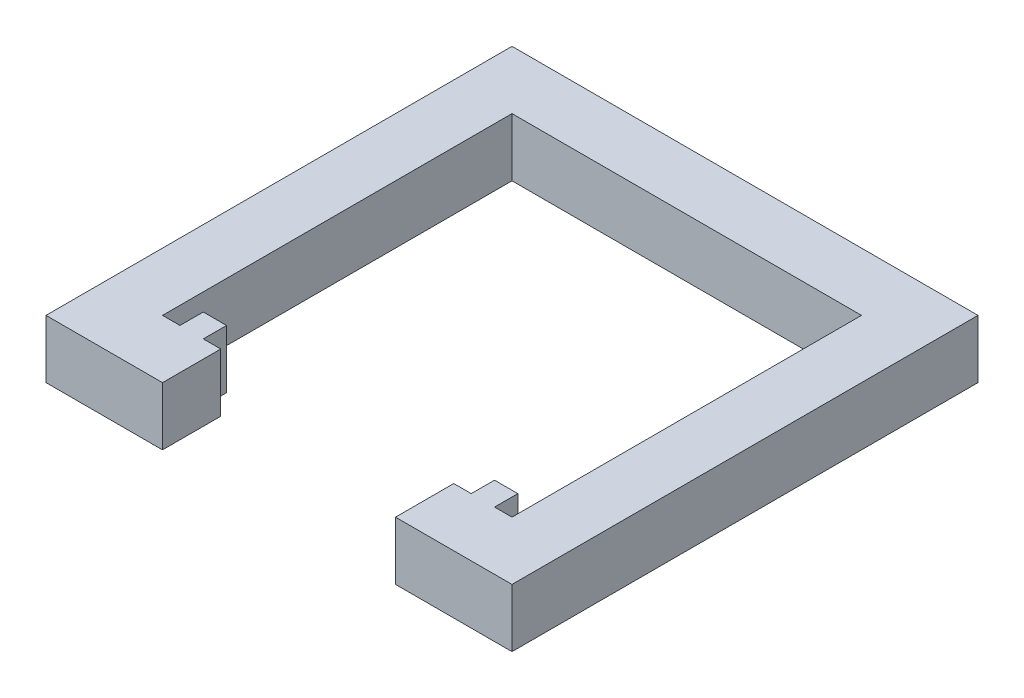
ISO-10303-21;
HEADER;
FILE_DESCRIPTION(('STEP AP214'),'2;1');
FILE_NAME('part.step','',(''),(''),'','','');
FILE_SCHEMA(('AUTOMOTIVE_DESIGN { 1 0 10303 214 1 1 1 1 }'));
ENDSEC;
DATA;
#1=APPLICATION_CONTEXT('core data for automotive mechanical design processes');
#2=APPLICATION_PROTOCOL_DEFINITION('international standard','automotive_design',2000,#1);
#3=PRODUCT_CONTEXT('',#1,'mechanical');
#4=PRODUCT('Part','Part','',(#3));
#5=PRODUCT_RELATED_PRODUCT_CATEGORY('part','',(#4));
#6=PRODUCT_DEFINITION_FORMATION('','',#4);
#7=PRODUCT_DEFINITION_CONTEXT('part definition',#1,'design');
#8=PRODUCT_DEFINITION('design','',#6,#7);
#9=PRODUCT_DEFINITION_SHAPE('','',#8);
#10=(LENGTH_UNIT() NAMED_UNIT(*) SI_UNIT(.MILLI.,.METRE.));
#11=(NAMED_UNIT(*) PLANE_ANGLE_UNIT() SI_UNIT($,.RADIAN.));
#12=(NAMED_UNIT(*) SI_UNIT($,.STERADIAN.) SOLID_ANGLE_UNIT());
#13=UNCERTAINTY_MEASURE_WITH_UNIT(LENGTH_MEASURE(1.E-05),#10,'distance_accuracy_value','');
#14=(GEOMETRIC_REPRESENTATION_CONTEXT(3) GLOBAL_UNCERTAINTY_ASSIGNED_CONTEXT((#13)) GLOBAL_UNIT_ASSIGNED_CONTEXT((#10,
#11,#12)) REPRESENTATION_CONTEXT('',''));
#15=CARTESIAN_POINT('',(0.,0.,0.));
#16=DIRECTION('',(0.,0.,1.));
#17=DIRECTION('',(1.,0.,0.));
#18=AXIS2_PLACEMENT_3D('',#15,#16,#17);
#19=CARTESIAN_POINT('',(198.887732839115,50.,0.));
#20=DIRECTION('',(1.,0.,0.));
#21=DIRECTION('',(0.,0.,-1.));
#22=AXIS2_PLACEMENT_3D('',#19,#20,#21);
#23=PLANE('',#22);
#24=DIRECTION('',(0.,0.,1.));
#25=VECTOR('',#24,1.);
#26=CARTESIAN_POINT('',(198.887732839115,0.,0.));
#27=LINE('',#26,#25);
#28=CARTESIAN_POINT('',(198.887732839115,0.,60.9875274496841));
#29=VERTEX_POINT('',#28);
#30=CARTESIAN_POINT('',(198.887732839116,0.,360.987527449684));
#31=VERTEX_POINT('',#30);
#32=EDGE_CURVE('E204',#29,#31,#27,.T.);
#33=ORIENTED_EDGE('',*,*,#32,.T.);
#34=DIRECTION('',(0.,-1.,0.));
#35=VECTOR('',#34,1.);
#36=CARTESIAN_POINT('',(198.887732839116,50.,360.987527449684));
#37=LINE('',#36,#35);
#38=CARTESIAN_POINT('',(198.887732839116,50.,360.987527449684));
#39=VERTEX_POINT('',#38);
#40=EDGE_CURVE('E11',#39,#31,#37,.T.);
#41=ORIENTED_EDGE('',*,*,#40,.F.);
#42=DIRECTION('',(0.,0.,1.));
#43=VECTOR('',#42,1.);
#44=CARTESIAN_POINT('',(198.887732839115,50.,0.));
#45=LINE('',#44,#43);
#46=CARTESIAN_POINT('',(198.887732839115,50.,60.9875274496841));
#47=VERTEX_POINT('',#46);
#48=EDGE_CURVE('E124',#47,#39,#45,.T.);
#49=ORIENTED_EDGE('',*,*,#48,.F.);
#50=DIRECTION('',(0.,-1.,0.));
#51=VECTOR('',#50,1.);
#52=CARTESIAN_POINT('',(198.887732839115,50.,60.9875274496841));
#53=LINE('',#52,#51);
#54=EDGE_CURVE('E199',#47,#29,#53,.T.);
#55=ORIENTED_EDGE('',*,*,#54,.T.);
#56=EDGE_LOOP('',(#33,#41,#49,#55));
#57=FACE_BOUND('',#56,.T.);
#58=ADVANCED_FACE('F36',(#57),#23,.F.);
#59=CARTESIAN_POINT('',(-4.00776664577145E-13,50.,360.987527449684));
#60=DIRECTION('',(0.,0.,-1.));
#61=DIRECTION('',(-1.,0.,0.));
#62=AXIS2_PLACEMENT_3D('',#59,#60,#61);
#63=PLANE('',#62);
#64=DIRECTION('',(1.,0.,0.));
#65=VECTOR('',#64,1.);
#66=CARTESIAN_POINT('',(-4.00776664577145E-13,0.,360.987527449684));
#67=LINE('',#66,#65);
#68=CARTESIAN_POINT('',(183.887732839116,0.,360.987527449684));
#69=VERTEX_POINT('',#68);
#70=EDGE_CURVE('E207',#69,#31,#67,.T.);
#71=ORIENTED_EDGE('',*,*,#70,.F.);
#72=DIRECTION('',(0.,-1.,0.));
#73=VECTOR('',#72,1.);
#74=CARTESIAN_POINT('',(183.887732839116,50.,360.987527449684));
#75=LINE('',#74,#73);
#76=CARTESIAN_POINT('',(183.887732839116,50.,360.987527449684));
#77=VERTEX_POINT('',#76);
#78=EDGE_CURVE('E44',#77,#69,#75,.T.);
#79=ORIENTED_EDGE('',*,*,#78,.F.);
#80=DIRECTION('',(1.,0.,0.));
#81=VECTOR('',#80,1.);
#82=CARTESIAN_POINT('',(-4.00776664577145E-13,50.,360.987527449684));
#83=LINE('',#82,#81);
#84=EDGE_CURVE('E308',#77,#39,#83,.T.);
#85=ORIENTED_EDGE('',*,*,#84,.T.);
#86=ORIENTED_EDGE('',*,*,#40,.T.);
#87=EDGE_LOOP('',(#71,#79,#85,#86));
#88=FACE_BOUND('',#87,.T.);
#89=ADVANCED_FACE('F295',(#88),#63,.T.);
#90=CARTESIAN_POINT('',(183.887732839115,50.,-2.55195493680131E-13));
#91=DIRECTION('',(1.,0.,0.));
#92=DIRECTION('',(0.,0.,-1.));
#93=AXIS2_PLACEMENT_3D('',#90,#91,#92);
#94=PLANE('',#93);
#95=DIRECTION('',(0.,0.,1.));
#96=VECTOR('',#95,1.);
#97=CARTESIAN_POINT('',(183.887732839115,0.,-2.55195493680131E-13));
#98=LINE('',#97,#96);
#99=CARTESIAN_POINT('',(183.887732839115,0.,340.987527449684));
#100=VERTEX_POINT('',#99);
#101=EDGE_CURVE('E210',#100,#69,#98,.T.);
#102=ORIENTED_EDGE('',*,*,#101,.F.);
#103=DIRECTION('',(0.,-1.,0.));
#104=VECTOR('',#103,1.);
#105=CARTESIAN_POINT('',(183.887732839115,50.,340.987527449684));
#106=LINE('',#105,#104);
#107=CARTESIAN_POINT('',(183.887732839115,50.,340.987527449684));
#108=VERTEX_POINT('',#107);
#109=EDGE_CURVE('E285',#108,#100,#106,.T.);
#110=ORIENTED_EDGE('',*,*,#109,.F.);
#111=DIRECTION('',(0.,0.,1.));
#112=VECTOR('',#111,1.);
#113=CARTESIAN_POINT('',(183.887732839115,50.,-2.55195493680131E-13));
#114=LINE('',#113,#112);
#115=EDGE_CURVE('E292',#108,#77,#114,.T.);
#116=ORIENTED_EDGE('',*,*,#115,.T.);
#117=ORIENTED_EDGE('',*,*,#78,.T.);
#118=EDGE_LOOP('',(#102,#110,#116,#117));
#119=FACE_BOUND('',#118,.T.);
#120=ADVANCED_FACE('F290',(#119),#94,.T.);
#121=CARTESIAN_POINT('',(0.,50.,340.987527449684));
#122=DIRECTION('',(0.,0.,-1.));
#123=DIRECTION('',(-1.,0.,0.));
#124=AXIS2_PLACEMENT_3D('',#121,#122,#123);
#125=PLANE('',#124);
#126=DIRECTION('',(1.,0.,0.));
#127=VECTOR('',#126,1.);
#128=CARTESIAN_POINT('',(0.,0.,340.987527449684));
#129=LINE('',#128,#127);
#130=CARTESIAN_POINT('',(163.887732839115,0.,340.987527449684));
#131=VERTEX_POINT('',#130);
#132=EDGE_CURVE('E214',#131,#100,#129,.T.);
#133=ORIENTED_EDGE('',*,*,#132,.F.);
#134=DIRECTION('',(0.,-1.,0.));
#135=VECTOR('',#134,1.);
#136=CARTESIAN_POINT('',(163.887732839115,50.,340.987527449684));
#137=LINE('',#136,#135);
#138=CARTESIAN_POINT('',(163.887732839115,50.,340.987527449684));
#139=VERTEX_POINT('',#138);
#140=EDGE_CURVE('E283',#139,#131,#137,.T.);
#141=ORIENTED_EDGE('',*,*,#140,.F.);
#142=DIRECTION('',(1.,0.,0.));
#143=VECTOR('',#142,1.);
#144=CARTESIAN_POINT('',(0.,50.,340.987527449684));
#145=LINE('',#144,#143);
#146=EDGE_CURVE('E307',#139,#108,#145,.T.);
#147=ORIENTED_EDGE('',*,*,#146,.T.);
#148=ORIENTED_EDGE('',*,*,#109,.T.);
#149=EDGE_LOOP('',(#133,#141,#147,#148));
#150=FACE_BOUND('',#149,.T.);
#151=ADVANCED_FACE('F303',(#150),#125,.T.);
#152=CARTESIAN_POINT('',(163.887732839115,50.,-2.27439918064502E-13));
#153=DIRECTION('',(1.,0.,0.));
#154=DIRECTION('',(0.,0.,-1.));
#155=AXIS2_PLACEMENT_3D('',#152,#153,#154);
#156=PLANE('',#155);
#157=DIRECTION('',(0.,0.,1.));
#158=VECTOR('',#157,1.);
#159=CARTESIAN_POINT('',(163.887732839115,0.,-2.27439918064502E-13));
#160=LINE('',#159,#158);
#161=CARTESIAN_POINT('',(163.887732839116,0.,360.987527449684));
#162=VERTEX_POINT('',#161);
#163=EDGE_CURVE('E217',#131,#162,#160,.T.);
#164=ORIENTED_EDGE('',*,*,#163,.T.);
#165=DIRECTION('',(0.,-1.,0.));
#166=VECTOR('',#165,1.);
#167=CARTESIAN_POINT('',(163.887732839116,50.,360.987527449684));
#168=LINE('',#167,#166);
#169=CARTESIAN_POINT('',(163.887732839116,50.,360.987527449684));
#170=VERTEX_POINT('',#169);
#171=EDGE_CURVE('E281',#170,#162,#168,.T.);
#172=ORIENTED_EDGE('',*,*,#171,.F.);
#173=DIRECTION('',(0.,0.,1.));
#174=VECTOR('',#173,1.);
#175=CARTESIAN_POINT('',(163.887732839115,50.,-2.27439918064502E-13));
#176=LINE('',#175,#174);
#177=EDGE_CURVE('E310',#139,#170,#176,.T.);
#178=ORIENTED_EDGE('',*,*,#177,.F.);
#179=ORIENTED_EDGE('',*,*,#140,.T.);
#180=EDGE_LOOP('',(#164,#172,#178,#179));
#181=FACE_BOUND('',#180,.T.);
#182=ADVANCED_FACE('F521',(#181),#156,.F.);
#183=CARTESIAN_POINT('',(148.887732839116,0.,360.987527449684));
#184=VERTEX_POINT('',#183);
#185=EDGE_CURVE('E211',#184,#162,#67,.T.);
#186=ORIENTED_EDGE('',*,*,#185,.F.);
#187=DIRECTION('',(0.,-1.,0.));
#188=VECTOR('',#187,1.);
#189=CARTESIAN_POINT('',(148.887732839116,50.,360.987527449684));
#190=LINE('',#189,#188);
#191=CARTESIAN_POINT('',(148.887732839116,50.,360.987527449684));
#192=VERTEX_POINT('',#191);
#193=EDGE_CURVE('E279',#192,#184,#190,.T.);
#194=ORIENTED_EDGE('',*,*,#193,.F.);
#195=EDGE_CURVE('E313',#192,#170,#83,.T.);
#196=ORIENTED_EDGE('',*,*,#195,.T.);
#197=ORIENTED_EDGE('',*,*,#171,.T.);
#198=EDGE_LOOP('',(#186,#194,#196,#197));
#199=FACE_BOUND('',#198,.T.);
#200=ADVANCED_FACE('F367',(#199),#63,.T.);
#201=CARTESIAN_POINT('',(148.887732839115,50.,0.));
#202=DIRECTION('',(1.,0.,0.));
#203=DIRECTION('',(0.,0.,-1.));
#204=AXIS2_PLACEMENT_3D('',#201,#202,#203);
#205=PLANE('',#204);
#206=DIRECTION('',(0.,0.,1.));
#207=VECTOR('',#206,1.);
#208=CARTESIAN_POINT('',(148.887732839115,0.,0.));
#209=LINE('',#208,#207);
#210=CARTESIAN_POINT('',(148.887732839116,0.,410.987527449684));
#211=VERTEX_POINT('',#210);
#212=EDGE_CURVE('E220',#184,#211,#209,.T.);
#213=ORIENTED_EDGE('',*,*,#212,.T.);
#214=DIRECTION('',(0.,-1.,0.));
#215=VECTOR('',#214,1.);
#216=CARTESIAN_POINT('',(148.887732839116,50.,410.987527449684));
#217=LINE('',#216,#215);
#218=CARTESIAN_POINT('',(148.887732839116,50.,410.987527449684));
#219=VERTEX_POINT('',#218);
#220=EDGE_CURVE('E276',#219,#211,#217,.T.);
#221=ORIENTED_EDGE('',*,*,#220,.F.);
#222=DIRECTION('',(0.,0.,1.));
#223=VECTOR('',#222,1.);
#224=CARTESIAN_POINT('',(148.887732839115,50.,0.));
#225=LINE('',#224,#223);
#226=EDGE_CURVE('E317',#192,#219,#225,.T.);
#227=ORIENTED_EDGE('',*,*,#226,.F.);
#228=ORIENTED_EDGE('',*,*,#193,.T.);
#229=EDGE_LOOP('',(#213,#221,#227,#228));
#230=FACE_BOUND('',#229,.T.);
#231=ADVANCED_FACE('F499',(#230),#205,.F.);
#232=CARTESIAN_POINT('',(0.,50.,410.987527449684));
#233=DIRECTION('',(0.,0.,-1.));
#234=DIRECTION('',(-1.,0.,0.));
#235=AXIS2_PLACEMENT_3D('',#232,#233,#234);
#236=PLANE('',#235);
#237=DIRECTION('',(1.,0.,0.));
#238=VECTOR('',#237,1.);
#239=CARTESIAN_POINT('',(0.,0.,410.987527449684));
#240=LINE('',#239,#238);
#241=CARTESIAN_POINT('',(248.887732839116,0.,410.987527449684));
#242=VERTEX_POINT('',#241);
#243=EDGE_CURVE('E222',#211,#242,#240,.T.);
#244=ORIENTED_EDGE('',*,*,#243,.T.);
#245=DIRECTION('',(0.,-1.,0.));
#246=VECTOR('',#245,1.);
#247=CARTESIAN_POINT('',(248.887732839116,50.,410.987527449684));
#248=LINE('',#247,#246);
#249=CARTESIAN_POINT('',(248.887732839116,50.,410.987527449684));
#250=VERTEX_POINT('',#249);
#251=EDGE_CURVE('E274',#250,#242,#248,.T.);
#252=ORIENTED_EDGE('',*,*,#251,.F.);
#253=DIRECTION('',(1.,0.,0.));
#254=VECTOR('',#253,1.);
#255=CARTESIAN_POINT('',(0.,50.,410.987527449684));
#256=LINE('',#255,#254);
#257=EDGE_CURVE('E319',#219,#250,#256,.T.);
#258=ORIENTED_EDGE('',*,*,#257,.F.);
#259=ORIENTED_EDGE('',*,*,#220,.T.);
#260=EDGE_LOOP('',(#244,#252,#258,#259));
#261=FACE_BOUND('',#260,.T.);
#262=ADVANCED_FACE('F487',(#261),#236,.F.);
#263=CARTESIAN_POINT('',(248.887732839115,50.,-1.20890390050824E-13));
#264=DIRECTION('',(1.,0.,0.));
#265=DIRECTION('',(0.,0.,-1.));
#266=AXIS2_PLACEMENT_3D('',#263,#264,#265);
#267=PLANE('',#266);
#268=DIRECTION('',(0.,0.,1.));
#269=VECTOR('',#268,1.);
#270=CARTESIAN_POINT('',(248.887732839115,0.,-1.20890390050824E-13));
#271=LINE('',#270,#269);
#272=CARTESIAN_POINT('',(248.887732839115,0.,10.9875274496841));
#273=VERTEX_POINT('',#272);
#274=EDGE_CURVE('E225',#273,#242,#271,.T.);
#275=ORIENTED_EDGE('',*,*,#274,.F.);
#276=DIRECTION('',(0.,-1.,0.));
#277=VECTOR('',#276,1.);
#278=CARTESIAN_POINT('',(248.887732839115,50.,10.9875274496841));
#279=LINE('',#278,#277);
#280=CARTESIAN_POINT('',(248.887732839115,50.,10.9875274496841));
#281=VERTEX_POINT('',#280);
#282=EDGE_CURVE('E272',#281,#273,#279,.T.);
#283=ORIENTED_EDGE('',*,*,#282,.F.);
#284=DIRECTION('',(0.,0.,1.));
#285=VECTOR('',#284,1.);
#286=CARTESIAN_POINT('',(248.887732839115,50.,-1.20890390050824E-13));
#287=LINE('',#286,#285);
#288=EDGE_CURVE('E321',#281,#250,#287,.T.);
#289=ORIENTED_EDGE('',*,*,#288,.T.);
#290=ORIENTED_EDGE('',*,*,#251,.T.);
#291=EDGE_LOOP('',(#275,#283,#289,#290));
#292=FACE_BOUND('',#291,.T.);
#293=ADVANCED_FACE('F475',(#292),#267,.T.);
#294=CARTESIAN_POINT('',(0.,50.,10.9875274496841));
#295=DIRECTION('',(0.,0.,-1.));
#296=DIRECTION('',(-1.,0.,0.));
#297=AXIS2_PLACEMENT_3D('',#294,#295,#296);
#298=PLANE('',#297);
#299=DIRECTION('',(1.,0.,0.));
#300=VECTOR('',#299,1.);
#301=CARTESIAN_POINT('',(0.,0.,10.9875274496841));
#302=LINE('',#301,#300);
#303=CARTESIAN_POINT('',(-151.112267160885,0.,10.9875274496841));
#304=VERTEX_POINT('',#303);
#305=EDGE_CURVE('E228',#304,#273,#302,.T.);
#306=ORIENTED_EDGE('',*,*,#305,.F.);
#307=DIRECTION('',(0.,-1.,0.));
#308=VECTOR('',#307,1.);
#309=CARTESIAN_POINT('',(-151.112267160885,50.,10.9875274496841));
#310=LINE('',#309,#308);
#311=CARTESIAN_POINT('',(-151.112267160885,50.,10.9875274496841));
#312=VERTEX_POINT('',#311);
#313=EDGE_CURVE('E270',#312,#304,#310,.T.);
#314=ORIENTED_EDGE('',*,*,#313,.F.);
#315=DIRECTION('',(1.,0.,0.));
#316=VECTOR('',#315,1.);
#317=CARTESIAN_POINT('',(0.,50.,10.9875274496841));
#318=LINE('',#317,#316);
#319=EDGE_CURVE('E324',#312,#281,#318,.T.);
#320=ORIENTED_EDGE('',*,*,#319,.T.);
#321=ORIENTED_EDGE('',*,*,#282,.T.);
#322=EDGE_LOOP('',(#306,#314,#320,#321));
#323=FACE_BOUND('',#322,.T.);
#324=ADVANCED_FACE('F464',(#323),#298,.T.);
#325=CARTESIAN_POINT('',(-151.112267160885,50.,0.));
#326=DIRECTION('',(1.,0.,0.));
#327=DIRECTION('',(0.,0.,-1.));
#328=AXIS2_PLACEMENT_3D('',#325,#326,#327);
#329=PLANE('',#328);
#330=DIRECTION('',(0.,0.,1.));
#331=VECTOR('',#330,1.);
#332=CARTESIAN_POINT('',(-151.112267160885,0.,0.));
#333=LINE('',#332,#331);
#334=CARTESIAN_POINT('',(-151.112267160884,0.,410.987527449684));
#335=VERTEX_POINT('',#334);
#336=EDGE_CURVE('E231',#304,#335,#333,.T.);
#337=ORIENTED_EDGE('',*,*,#336,.T.);
#338=DIRECTION('',(0.,-1.,0.));
#339=VECTOR('',#338,1.);
#340=CARTESIAN_POINT('',(-151.112267160884,50.,410.987527449684));
#341=LINE('',#340,#339);
#342=CARTESIAN_POINT('',(-151.112267160884,50.,410.987527449684));
#343=VERTEX_POINT('',#342);
#344=EDGE_CURVE('E267',#343,#335,#341,.T.);
#345=ORIENTED_EDGE('',*,*,#344,.F.);
#346=DIRECTION('',(0.,0.,1.));
#347=VECTOR('',#346,1.);
#348=CARTESIAN_POINT('',(-151.112267160885,50.,0.));
#349=LINE('',#348,#347);
#350=EDGE_CURVE('E327',#312,#343,#349,.T.);
#351=ORIENTED_EDGE('',*,*,#350,.F.);
#352=ORIENTED_EDGE('',*,*,#313,.T.);
#353=EDGE_LOOP('',(#337,#345,#351,#352));
#354=FACE_BOUND('',#353,.T.);
#355=ADVANCED_FACE('F453',(#354),#329,.F.);
#356=CARTESIAN_POINT('',(0.,50.,410.987527449684));
#357=DIRECTION('',(0.,0.,-1.));
#358=DIRECTION('',(-1.,0.,0.));
#359=AXIS2_PLACEMENT_3D('',#356,#357,#358);
#360=PLANE('',#359);
#361=DIRECTION('',(1.,0.,0.));
#362=VECTOR('',#361,1.);
#363=CARTESIAN_POINT('',(0.,0.,410.987527449684));
#364=LINE('',#363,#362);
#365=CARTESIAN_POINT('',(-51.1122671608844,0.,410.987527449684));
#366=VERTEX_POINT('',#365);
#367=EDGE_CURVE('E233',#335,#366,#364,.T.);
#368=ORIENTED_EDGE('',*,*,#367,.T.);
#369=DIRECTION('',(0.,-1.,0.));
#370=VECTOR('',#369,1.);
#371=CARTESIAN_POINT('',(-51.1122671608844,50.,410.987527449684));
#372=LINE('',#371,#370);
#373=CARTESIAN_POINT('',(-51.1122671608844,50.,410.987527449684));
#374=VERTEX_POINT('',#373);
#375=EDGE_CURVE('E265',#374,#366,#372,.T.);
#376=ORIENTED_EDGE('',*,*,#375,.F.);
#377=DIRECTION('',(1.,0.,0.));
#378=VECTOR('',#377,1.);
#379=CARTESIAN_POINT('',(0.,50.,410.987527449684));
#380=LINE('',#379,#378);
#381=EDGE_CURVE('E329',#343,#374,#380,.T.);
#382=ORIENTED_EDGE('',*,*,#381,.F.);
#383=ORIENTED_EDGE('',*,*,#344,.T.);
#384=EDGE_LOOP('',(#368,#376,#382,#383));
#385=FACE_BOUND('',#384,.T.);
#386=ADVANCED_FACE('F443',(#385),#360,.F.);
#387=CARTESIAN_POINT('',(-51.1122671608846,50.,0.));
#388=DIRECTION('',(1.,0.,0.));
#389=DIRECTION('',(0.,0.,-1.));
#390=AXIS2_PLACEMENT_3D('',#387,#388,#389);
#391=PLANE('',#390);
#392=DIRECTION('',(0.,0.,1.));
#393=VECTOR('',#392,1.);
#394=CARTESIAN_POINT('',(-51.1122671608846,0.,0.));
#395=LINE('',#394,#393);
#396=CARTESIAN_POINT('',(-51.1122671608845,0.,360.987527449684));
#397=VERTEX_POINT('',#396);
#398=EDGE_CURVE('E236',#397,#366,#395,.T.);
#399=ORIENTED_EDGE('',*,*,#398,.F.);
#400=DIRECTION('',(0.,-1.,0.));
#401=VECTOR('',#400,1.);
#402=CARTESIAN_POINT('',(-51.1122671608845,50.,360.987527449684));
#403=LINE('',#402,#401);
#404=CARTESIAN_POINT('',(-51.1122671608845,50.,360.987527449684));
#405=VERTEX_POINT('',#404);
#406=EDGE_CURVE('E263',#405,#397,#403,.T.);
#407=ORIENTED_EDGE('',*,*,#406,.F.);
#408=DIRECTION('',(0.,0.,1.));
#409=VECTOR('',#408,1.);
#410=CARTESIAN_POINT('',(-51.1122671608846,50.,0.));
#411=LINE('',#410,#409);
#412=EDGE_CURVE('E331',#405,#374,#411,.T.);
#413=ORIENTED_EDGE('',*,*,#412,.T.);
#414=ORIENTED_EDGE('',*,*,#375,.T.);
#415=EDGE_LOOP('',(#399,#407,#413,#414));
#416=FACE_BOUND('',#415,.T.);
#417=ADVANCED_FACE('F433',(#416),#391,.T.);
#418=CARTESIAN_POINT('',(4.00776664577145E-13,50.,360.987527449684));
#419=DIRECTION('',(0.,0.,-1.));
#420=DIRECTION('',(-1.,0.,0.));
#421=AXIS2_PLACEMENT_3D('',#418,#419,#420);
#422=PLANE('',#421);
#423=DIRECTION('',(1.,0.,0.));
#424=VECTOR('',#423,1.);
#425=CARTESIAN_POINT('',(4.00776664577145E-13,0.,360.987527449684));
#426=LINE('',#425,#424);
#427=CARTESIAN_POINT('',(-66.1122671608845,0.,360.987527449684));
#428=VERTEX_POINT('',#427);
#429=EDGE_CURVE('E239',#428,#397,#426,.T.);
#430=ORIENTED_EDGE('',*,*,#429,.F.);
#431=DIRECTION('',(0.,-1.,0.));
#432=VECTOR('',#431,1.);
#433=CARTESIAN_POINT('',(-66.1122671608845,50.,360.987527449684));
#434=LINE('',#433,#432);
#435=CARTESIAN_POINT('',(-66.1122671608845,50.,360.987527449684));
#436=VERTEX_POINT('',#435);
#437=EDGE_CURVE('E261',#436,#428,#434,.T.);
#438=ORIENTED_EDGE('',*,*,#437,.F.);
#439=DIRECTION('',(1.,0.,0.));
#440=VECTOR('',#439,1.);
#441=CARTESIAN_POINT('',(4.00776664577145E-13,50.,360.987527449684));
#442=LINE('',#441,#440);
#443=EDGE_CURVE('E196',#436,#405,#442,.T.);
#444=ORIENTED_EDGE('',*,*,#443,.T.);
#445=ORIENTED_EDGE('',*,*,#406,.T.);
#446=EDGE_LOOP('',(#430,#438,#444,#445));
#447=FACE_BOUND('',#446,.T.);
#448=ADVANCED_FACE('F359',(#447),#422,.T.);
#449=CARTESIAN_POINT('',(-66.1122671608842,50.,0.));
#450=DIRECTION('',(1.,0.,0.));
#451=DIRECTION('',(0.,0.,-1.));
#452=AXIS2_PLACEMENT_3D('',#449,#450,#451);
#453=PLANE('',#452);
#454=DIRECTION('',(0.,0.,1.));
#455=VECTOR('',#454,1.);
#456=CARTESIAN_POINT('',(-66.1122671608842,0.,0.));
#457=LINE('',#456,#455);
#458=CARTESIAN_POINT('',(-66.1122671608844,0.,340.987527449684));
#459=VERTEX_POINT('',#458);
#460=EDGE_CURVE('E242',#459,#428,#457,.T.);
#461=ORIENTED_EDGE('',*,*,#460,.F.);
#462=DIRECTION('',(0.,-1.,0.));
#463=VECTOR('',#462,1.);
#464=CARTESIAN_POINT('',(-66.1122671608844,50.,340.987527449684));
#465=LINE('',#464,#463);
#466=CARTESIAN_POINT('',(-66.1122671608844,50.,340.987527449684));
#467=VERTEX_POINT('',#466);
#468=EDGE_CURVE('E259',#467,#459,#465,.T.);
#469=ORIENTED_EDGE('',*,*,#468,.F.);
#470=DIRECTION('',(0.,0.,1.));
#471=VECTOR('',#470,1.);
#472=CARTESIAN_POINT('',(-66.1122671608842,50.,0.));
#473=LINE('',#472,#471);
#474=EDGE_CURVE('E335',#467,#436,#473,.T.);
#475=ORIENTED_EDGE('',*,*,#474,.T.);
#476=ORIENTED_EDGE('',*,*,#437,.T.);
#477=EDGE_LOOP('',(#461,#469,#475,#476));
#478=FACE_BOUND('',#477,.T.);
#479=ADVANCED_FACE('F347',(#478),#453,.T.);
#480=CARTESIAN_POINT('',(0.,50.,340.987527449684));
#481=DIRECTION('',(0.,0.,-1.));
#482=DIRECTION('',(-1.,0.,0.));
#483=AXIS2_PLACEMENT_3D('',#480,#481,#482);
#484=PLANE('',#483);
#485=DIRECTION('',(1.,0.,0.));
#486=VECTOR('',#485,1.);
#487=CARTESIAN_POINT('',(0.,0.,340.987527449684));
#488=LINE('',#487,#486);
#489=CARTESIAN_POINT('',(-86.1122671608845,0.,340.987527449684));
#490=VERTEX_POINT('',#489);
#491=EDGE_CURVE('E245',#490,#459,#488,.T.);
#492=ORIENTED_EDGE('',*,*,#491,.F.);
#493=DIRECTION('',(0.,-1.,0.));
#494=VECTOR('',#493,1.);
#495=CARTESIAN_POINT('',(-86.1122671608845,50.,340.987527449684));
#496=LINE('',#495,#494);
#497=CARTESIAN_POINT('',(-86.1122671608845,50.,340.987527449684));
#498=VERTEX_POINT('',#497);
#499=EDGE_CURVE('E257',#498,#490,#496,.T.);
#500=ORIENTED_EDGE('',*,*,#499,.F.);
#501=DIRECTION('',(1.,0.,0.));
#502=VECTOR('',#501,1.);
#503=CARTESIAN_POINT('',(0.,50.,340.987527449684));
#504=LINE('',#503,#502);
#505=EDGE_CURVE('E337',#498,#467,#504,.T.);
#506=ORIENTED_EDGE('',*,*,#505,.T.);
#507=ORIENTED_EDGE('',*,*,#468,.T.);
#508=EDGE_LOOP('',(#492,#500,#506,#507));
#509=FACE_BOUND('',#508,.T.);
#510=ADVANCED_FACE('F341',(#509),#484,.T.);
#511=CARTESIAN_POINT('',(-86.1122671608842,50.,0.));
#512=DIRECTION('',(1.,0.,0.));
#513=DIRECTION('',(0.,0.,-1.));
#514=AXIS2_PLACEMENT_3D('',#511,#512,#513);
#515=PLANE('',#514);
#516=DIRECTION('',(0.,0.,1.));
#517=VECTOR('',#516,1.);
#518=CARTESIAN_POINT('',(-86.1122671608842,0.,0.));
#519=LINE('',#518,#517);
#520=CARTESIAN_POINT('',(-86.1122671608845,0.,360.987527449684));
#521=VERTEX_POINT('',#520);
#522=EDGE_CURVE('E248',#490,#521,#519,.T.);
#523=ORIENTED_EDGE('',*,*,#522,.T.);
#524=DIRECTION('',(0.,-1.,0.));
#525=VECTOR('',#524,1.);
#526=CARTESIAN_POINT('',(-86.1122671608845,50.,360.987527449684));
#527=LINE('',#526,#525);
#528=CARTESIAN_POINT('',(-86.1122671608845,50.,360.987527449684));
#529=VERTEX_POINT('',#528);
#530=EDGE_CURVE('E187',#529,#521,#527,.T.);
#531=ORIENTED_EDGE('',*,*,#530,.F.);
#532=DIRECTION('',(0.,0.,1.));
#533=VECTOR('',#532,1.);
#534=CARTESIAN_POINT('',(-86.1122671608842,50.,0.));
#535=LINE('',#534,#533);
#536=EDGE_CURVE('E193',#498,#529,#535,.T.);
#537=ORIENTED_EDGE('',*,*,#536,.F.);
#538=ORIENTED_EDGE('',*,*,#499,.T.);
#539=EDGE_LOOP('',(#523,#531,#537,#538));
#540=FACE_BOUND('',#539,.T.);
#541=ADVANCED_FACE('F351',(#540),#515,.F.);
#542=CARTESIAN_POINT('',(-101.112267160884,0.,360.987527449684));
#543=VERTEX_POINT('',#542);
#544=EDGE_CURVE('E182',#543,#521,#426,.T.);
#545=ORIENTED_EDGE('',*,*,#544,.F.);
#546=DIRECTION('',(0.,-1.,0.));
#547=VECTOR('',#546,1.);
#548=CARTESIAN_POINT('',(-101.112267160884,50.,360.987527449684));
#549=LINE('',#548,#547);
#550=CARTESIAN_POINT('',(-101.112267160884,50.,360.987527449684));
#551=VERTEX_POINT('',#550);
#552=EDGE_CURVE('E177',#551,#543,#549,.T.);
#553=ORIENTED_EDGE('',*,*,#552,.F.);
#554=EDGE_CURVE('E180',#551,#529,#442,.T.);
#555=ORIENTED_EDGE('',*,*,#554,.T.);
#556=ORIENTED_EDGE('',*,*,#530,.T.);
#557=EDGE_LOOP('',(#545,#553,#555,#556));
#558=FACE_BOUND('',#557,.T.);
#559=ADVANCED_FACE('F179',(#558),#422,.T.);
#560=CARTESIAN_POINT('',(-101.112267160885,50.,0.));
#561=DIRECTION('',(1.,0.,0.));
#562=DIRECTION('',(0.,0.,-1.));
#563=AXIS2_PLACEMENT_3D('',#560,#561,#562);
#564=PLANE('',#563);
#565=DIRECTION('',(0.,0.,1.));
#566=VECTOR('',#565,1.);
#567=CARTESIAN_POINT('',(-101.112267160885,0.,0.));
#568=LINE('',#567,#566);
#569=CARTESIAN_POINT('',(-101.112267160885,0.,60.9875274496841));
#570=VERTEX_POINT('',#569);
#571=EDGE_CURVE('E251',#570,#543,#568,.T.);
#572=ORIENTED_EDGE('',*,*,#571,.F.);
#573=DIRECTION('',(0.,-1.,0.));
#574=VECTOR('',#573,1.);
#575=CARTESIAN_POINT('',(-101.112267160885,50.,60.9875274496841));
#576=LINE('',#575,#574);
#577=CARTESIAN_POINT('',(-101.112267160885,50.,60.9875274496841));
#578=VERTEX_POINT('',#577);
#579=EDGE_CURVE('E115',#578,#570,#576,.T.);
#580=ORIENTED_EDGE('',*,*,#579,.F.);
#581=DIRECTION('',(0.,0.,1.));
#582=VECTOR('',#581,1.);
#583=CARTESIAN_POINT('',(-101.112267160885,50.,0.));
#584=LINE('',#583,#582);
#585=EDGE_CURVE('E190',#578,#551,#584,.T.);
#586=ORIENTED_EDGE('',*,*,#585,.T.);
#587=ORIENTED_EDGE('',*,*,#552,.T.);
#588=EDGE_LOOP('',(#572,#580,#586,#587));
#589=FACE_BOUND('',#588,.T.);
#590=ADVANCED_FACE('F197',(#589),#564,.T.);
#591=CARTESIAN_POINT('',(0.,50.,60.9875274496841));
#592=DIRECTION('',(0.,0.,-1.));
#593=DIRECTION('',(-1.,0.,0.));
#594=AXIS2_PLACEMENT_3D('',#591,#592,#593);
#595=PLANE('',#594);
#596=DIRECTION('',(1.,0.,0.));
#597=VECTOR('',#596,1.);
#598=CARTESIAN_POINT('',(0.,0.,60.9875274496841));
#599=LINE('',#598,#597);
#600=EDGE_CURVE('E118',#570,#29,#599,.T.);
#601=ORIENTED_EDGE('',*,*,#600,.T.);
#602=ORIENTED_EDGE('',*,*,#54,.F.);
#603=DIRECTION('',(1.,0.,0.));
#604=VECTOR('',#603,1.);
#605=CARTESIAN_POINT('',(0.,50.,60.9875274496841));
#606=LINE('',#605,#604);
#607=EDGE_CURVE('E52',#578,#47,#606,.T.);
#608=ORIENTED_EDGE('',*,*,#607,.F.);
#609=ORIENTED_EDGE('',*,*,#579,.T.);
#610=EDGE_LOOP('',(#601,#602,#608,#609));
#611=FACE_BOUND('',#610,.T.);
#612=ADVANCED_FACE('F368',(#611),#595,.F.);
#613=CARTESIAN_POINT('',(0.,50.,0.));
#614=DIRECTION('',(0.,1.,0.));
#615=DIRECTION('',(0.,0.,1.));
#616=AXIS2_PLACEMENT_3D('',#613,#614,#615);
#617=PLANE('',#616);
#618=ORIENTED_EDGE('',*,*,#48,.T.);
#619=ORIENTED_EDGE('',*,*,#84,.F.);
#620=ORIENTED_EDGE('',*,*,#115,.F.);
#621=ORIENTED_EDGE('',*,*,#146,.F.);
#622=ORIENTED_EDGE('',*,*,#177,.T.);
#623=ORIENTED_EDGE('',*,*,#195,.F.);
#624=ORIENTED_EDGE('',*,*,#226,.T.);
#625=ORIENTED_EDGE('',*,*,#257,.T.);
#626=ORIENTED_EDGE('',*,*,#288,.F.);
#627=ORIENTED_EDGE('',*,*,#319,.F.);
#628=ORIENTED_EDGE('',*,*,#350,.T.);
#629=ORIENTED_EDGE('',*,*,#381,.T.);
#630=ORIENTED_EDGE('',*,*,#412,.F.);
#631=ORIENTED_EDGE('',*,*,#443,.F.);
#632=ORIENTED_EDGE('',*,*,#474,.F.);
#633=ORIENTED_EDGE('',*,*,#505,.F.);
#634=ORIENTED_EDGE('',*,*,#536,.T.);
#635=ORIENTED_EDGE('',*,*,#554,.F.);
#636=ORIENTED_EDGE('',*,*,#585,.F.);
#637=ORIENTED_EDGE('',*,*,#607,.T.);
#638=EDGE_LOOP('',(#618,#619,#620,#621,#622,#623,#624,#625,#626,#627,#628,#629,#630,#631,#632,
#633,#634,#635,#636,#637));
#639=FACE_BOUND('',#638,.T.);
#640=ADVANCED_FACE('F189',(#639),#617,.T.);
#641=CARTESIAN_POINT('',(0.,0.,0.));
#642=DIRECTION('',(0.,1.,0.));
#643=DIRECTION('',(0.,0.,1.));
#644=AXIS2_PLACEMENT_3D('',#641,#642,#643);
#645=PLANE('',#644);
#646=ORIENTED_EDGE('',*,*,#32,.F.);
#647=ORIENTED_EDGE('',*,*,#600,.F.);
#648=ORIENTED_EDGE('',*,*,#571,.T.);
#649=ORIENTED_EDGE('',*,*,#544,.T.);
#650=ORIENTED_EDGE('',*,*,#522,.F.);
#651=ORIENTED_EDGE('',*,*,#491,.T.);
#652=ORIENTED_EDGE('',*,*,#460,.T.);
#653=ORIENTED_EDGE('',*,*,#429,.T.);
#654=ORIENTED_EDGE('',*,*,#398,.T.);
#655=ORIENTED_EDGE('',*,*,#367,.F.);
#656=ORIENTED_EDGE('',*,*,#336,.F.);
#657=ORIENTED_EDGE('',*,*,#305,.T.);
#658=ORIENTED_EDGE('',*,*,#274,.T.);
#659=ORIENTED_EDGE('',*,*,#243,.F.);
#660=ORIENTED_EDGE('',*,*,#212,.F.);
#661=ORIENTED_EDGE('',*,*,#185,.T.);
#662=ORIENTED_EDGE('',*,*,#163,.F.);
#663=ORIENTED_EDGE('',*,*,#132,.T.);
#664=ORIENTED_EDGE('',*,*,#101,.T.);
#665=ORIENTED_EDGE('',*,*,#70,.T.);
#666=EDGE_LOOP('',(#646,#647,#648,#649,#650,#651,#652,#653,#654,#655,#656,#657,#658,#659,#660,
#661,#662,#663,#664,#665));
#667=FACE_BOUND('',#666,.T.);
#668=ADVANCED_FACE('F298',(#667),#645,.F.);
#669=CLOSED_SHELL('',(#58,#89,#120,#151,#182,#200,#231,#262,#293,#324,#355,#386,#417,#448,#479,
#510,#541,#559,#590,#612,#640,#668));
#670=MANIFOLD_SOLID_BREP('B2',#669);
#671=ADVANCED_BREP_SHAPE_REPRESENTATION('',(#18,#670),#14);
#672=SHAPE_DEFINITION_REPRESENTATION(#9,#671);
ENDSEC;
END-ISO-10303-21;
